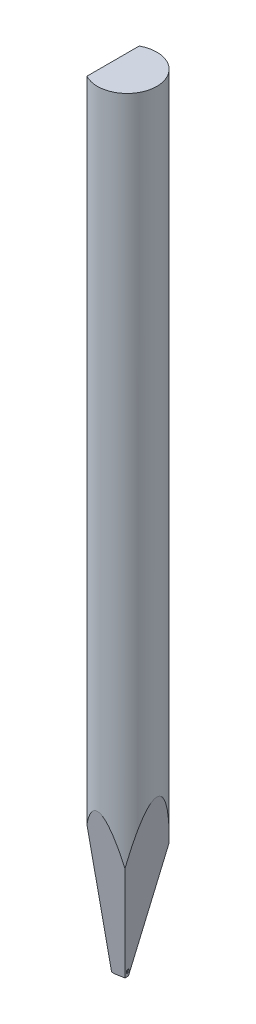
ISO-10303-21;
HEADER;
FILE_DESCRIPTION(('STEP AP214'),'2;1');
FILE_NAME('part.step','',(''),(''),'','','');
FILE_SCHEMA(('AUTOMOTIVE_DESIGN { 1 0 10303 214 1 1 1 1 }'));
ENDSEC;
DATA;
#1=APPLICATION_CONTEXT('core data for automotive mechanical design processes');
#2=APPLICATION_PROTOCOL_DEFINITION('international standard','automotive_design',2000,#1);
#3=PRODUCT_CONTEXT('',#1,'mechanical');
#4=PRODUCT('Part','Part','',(#3));
#5=PRODUCT_RELATED_PRODUCT_CATEGORY('part','',(#4));
#6=PRODUCT_DEFINITION_FORMATION('','',#4);
#7=PRODUCT_DEFINITION_CONTEXT('part definition',#1,'design');
#8=PRODUCT_DEFINITION('design','',#6,#7);
#9=PRODUCT_DEFINITION_SHAPE('','',#8);
#10=(LENGTH_UNIT() NAMED_UNIT(*) SI_UNIT(.MILLI.,.METRE.));
#11=(NAMED_UNIT(*) PLANE_ANGLE_UNIT() SI_UNIT($,.RADIAN.));
#12=(NAMED_UNIT(*) SI_UNIT($,.STERADIAN.) SOLID_ANGLE_UNIT());
#13=UNCERTAINTY_MEASURE_WITH_UNIT(LENGTH_MEASURE(1.E-05),#10,'distance_accuracy_value','');
#14=(GEOMETRIC_REPRESENTATION_CONTEXT(3) GLOBAL_UNCERTAINTY_ASSIGNED_CONTEXT((#13)) GLOBAL_UNIT_ASSIGNED_CONTEXT((#10,
#11,#12)) REPRESENTATION_CONTEXT('',''));
#15=CARTESIAN_POINT('',(0.,0.,0.));
#16=DIRECTION('',(0.,0.,1.));
#17=DIRECTION('',(1.,0.,0.));
#18=AXIS2_PLACEMENT_3D('',#15,#16,#17);
#19=CARTESIAN_POINT('',(-0.35306,0.02286,26.4515969491216));
#20=DIRECTION('',(0.,0.,-1.));
#21=DIRECTION('',(-1.,0.,0.));
#22=AXIS2_PLACEMENT_3D('',#19,#20,#21);
#23=CYLINDRICAL_SURFACE('',#22,0.02286);
#24=DIRECTION('',(0.,0.,-1.));
#25=VECTOR('',#24,1.);
#26=CARTESIAN_POINT('',(-0.35306,0.,26.4515969491216));
#27=LINE('',#26,#25);
#28=CARTESIAN_POINT('',(-0.353059999999999,0.,-0.0305592719154106));
#29=VERTEX_POINT('',#28);
#30=CARTESIAN_POINT('',(-0.35306,0.,-0.0380999999999992));
#31=VERTEX_POINT('',#30);
#32=EDGE_CURVE('E226',#29,#31,#27,.T.);
#33=ORIENTED_EDGE('',*,*,#32,.F.);
#34=CARTESIAN_POINT('',(-0.353060000136931,0.,0.0305592719154105));
#35=CARTESIAN_POINT('',(-0.359442468957151,3.82309618898692E-11,0.0308319241420848));
#36=CARTESIAN_POINT('',(-0.364146777185343,0.00166563698878413,0.0243095121966664));
#37=CARTESIAN_POINT('',(-0.371647527256887,0.00909526449847842,0.0155317534591453));
#38=CARTESIAN_POINT('',(-0.374441075969854,0.0127692328737348,0.0124228194201893));
#39=CARTESIAN_POINT('',(-0.376087286033859,0.0216673996389667,0.00775783689648507));
#40=CARTESIAN_POINT('',(-0.376022588475999,0.025318975171989,0.00619824157381067));
#41=CARTESIAN_POINT('',(-0.374406054380592,0.0316732281710679,0.00309584571980608));
#42=CARTESIAN_POINT('',(-0.372857795646379,0.0342892121612932,0.00155884239990519));
#43=CARTESIAN_POINT('',(-0.372856893602476,0.0342907745483825,-0.00153003910448281));
#44=CARTESIAN_POINT('',(-0.374404543387544,0.0316781034314046,-0.00307639910111903));
#45=CARTESIAN_POINT('',(-0.376023198376415,0.0253176413235304,-0.00620325873008807));
#46=CARTESIAN_POINT('',(-0.376087099954471,0.0216631391996921,-0.00777053455274175));
#47=CARTESIAN_POINT('',(-0.374438996349051,0.0127645085577113,-0.0124354531726147));
#48=CARTESIAN_POINT('',(-0.371654981711114,0.00910677726717238,-0.0155000901940218));
#49=CARTESIAN_POINT('',(-0.364172422185122,0.00168281428800278,-0.0242565037445474));
#50=CARTESIAN_POINT('',(-0.359457905415776,0.,-0.0308389625094695));
#51=CARTESIAN_POINT('',(-0.35306,0.,-0.0305592719154105));
#52=(BOUNDED_CURVE() B_SPLINE_CURVE(3,(#34,#35,#36,#37,#38,#39,#40,#41,#42,#43,#44,#45,#46,#47,
#48,#49,#50,#51),.UNSPECIFIED.,.F.,.F.) B_SPLINE_CURVE_WITH_KNOTS((4,2,2,2,2,2,2,2,4),(0.,
1.79522066859617E-05,2.6928310028942E-05,3.14163617004321E-05,3.59044133719222E-05,
4.03924650434123E-05,4.48805167149025E-05,5.38566200578827E-05,7.18088267438432E-05),
.UNSPECIFIED.) CURVE() GEOMETRIC_REPRESENTATION_ITEM() RATIONAL_B_SPLINE_CURVE((1.,1.,1.,1.,1.,
1.,1.,1.,1.,1.,1.,1.,1.,1.,1.,1.,1.,1.)) REPRESENTATION_ITEM(''));
#53=CARTESIAN_POINT('',(-0.375907824541282,0.02285997398056,-0.00729205217639912));
#54=VERTEX_POINT('',#53);
#55=EDGE_CURVE('E371',#29,#54,#52,.F.);
#56=ORIENTED_EDGE('',*,*,#55,.T.);
#57=DIRECTION('',(0.,0.,-1.));
#58=VECTOR('',#57,1.);
#59=CARTESIAN_POINT('',(-0.37592,0.02286,26.4515969491216));
#60=LINE('',#59,#58);
#61=CARTESIAN_POINT('',(-0.37592,0.02286,-0.0421308347789973));
#62=VERTEX_POINT('',#61);
#63=EDGE_CURVE('E214',#54,#62,#60,.T.);
#64=ORIENTED_EDGE('',*,*,#63,.T.);
#65=CARTESIAN_POINT('',(-0.35306,0.02286,-0.0421308347789973));
#66=DIRECTION('',(0.,-0.173648177666931,-0.984807753012208));
#67=DIRECTION('',(0.,0.984807753012208,-0.173648177666931));
#68=AXIS2_PLACEMENT_3D('',#65,#66,#67);
#69=ELLIPSE('',#68,0.0232126523477081,0.02286);
#70=EDGE_CURVE('E438',#62,#31,#69,.F.);
#71=ORIENTED_EDGE('',*,*,#70,.T.);
#72=EDGE_LOOP('',(#33,#56,#64,#71));
#73=FACE_BOUND('',#72,.T.);
#74=ADVANCED_FACE('F47',(#73),#23,.T.);
#75=CARTESIAN_POINT('',(0.,0.,0.));
#76=DIRECTION('',(0.,1.,0.));
#77=DIRECTION('',(0.,0.,1.));
#78=AXIS2_PLACEMENT_3D('',#75,#76,#77);
#79=PLANE('',#78);
#80=DIRECTION('',(-1.,0.,0.));
#81=VECTOR('',#80,1.);
#82=CARTESIAN_POINT('',(26.8452969491216,0.,0.0305592719154106));
#83=LINE('',#82,#81);
#84=CARTESIAN_POINT('',(-0.289560000000001,0.,0.0305592719154106));
#85=VERTEX_POINT('',#84);
#86=CARTESIAN_POINT('',(-0.35306,0.,0.030559272275299));
#87=VERTEX_POINT('',#86);
#88=EDGE_CURVE('E389',#85,#87,#83,.T.);
#89=ORIENTED_EDGE('',*,*,#88,.F.);
#90=DIRECTION('',(0.,0.,-1.));
#91=VECTOR('',#90,1.);
#92=CARTESIAN_POINT('',(-0.28956,0.,27.2760283406468));
#93=LINE('',#92,#91);
#94=CARTESIAN_POINT('',(-0.289560000000006,0.,0.0381));
#95=VERTEX_POINT('',#94);
#96=EDGE_CURVE('E485',#95,#85,#93,.T.);
#97=ORIENTED_EDGE('',*,*,#96,.F.);
#98=DIRECTION('',(-1.,0.,0.));
#99=VECTOR('',#98,1.);
#100=CARTESIAN_POINT('',(26.8738719491216,0.,0.0381));
#101=LINE('',#100,#99);
#102=CARTESIAN_POINT('',(-0.35306,0.,0.0380999999999983));
#103=VERTEX_POINT('',#102);
#104=EDGE_CURVE('E473',#95,#103,#101,.T.);
#105=ORIENTED_EDGE('',*,*,#104,.T.);
#106=EDGE_CURVE('E222',#103,#87,#27,.T.);
#107=ORIENTED_EDGE('',*,*,#106,.T.);
#108=EDGE_LOOP('',(#89,#97,#105,#107));
#109=FACE_BOUND('',#108,.T.);
#110=ADVANCED_FACE('F265',(#109),#79,.F.);
#111=CARTESIAN_POINT('',(26.8738719491216,0.,0.0381));
#112=DIRECTION('',(0.,-0.173648177666931,0.984807753012208));
#113=DIRECTION('',(0.,-0.984807753012208,-0.173648177666931));
#114=AXIS2_PLACEMENT_3D('',#111,#112,#113);
#115=PLANE('',#114);
#116=CARTESIAN_POINT('',(-0.35306,0.02286,0.0421308347789938));
#117=DIRECTION('',(0.,-0.173648177666931,0.984807753012208));
#118=DIRECTION('',(0.,-0.984807753012208,-0.173648177666931));
#119=AXIS2_PLACEMENT_3D('',#116,#117,#118);
#120=ELLIPSE('',#119,0.0232126523477081,0.02286);
#121=CARTESIAN_POINT('',(-0.37592,0.02286,0.0421308347789938));
#122=VERTEX_POINT('',#121);
#123=EDGE_CURVE('E491',#103,#122,#120,.F.);
#124=ORIENTED_EDGE('',*,*,#123,.F.);
#125=ORIENTED_EDGE('',*,*,#104,.F.);
#126=DIRECTION('',(-0.984346441568213,-0.173566836012845,-0.0306045161452665));
#127=VECTOR('',#126,1.);
#128=CARTESIAN_POINT('',(26.0301191721138,4.64086956163433,0.856410517664803));
#129=LINE('',#128,#127);
#130=CARTESIAN_POINT('',(-0.0116803882692911,0.0489976729369165,0.0467396117307074));
#131=VERTEX_POINT('',#130);
#132=EDGE_CURVE('E476',#131,#95,#129,.T.);
#133=ORIENTED_EDGE('',*,*,#132,.F.);
#134=DIRECTION('',(-0.171087869746036,-0.970287525247814,-0.171087869746036));
#135=VECTOR('',#134,1.);
#136=CARTESIAN_POINT('',(0.766901483986015,4.46455489014234,0.825321483986016));
#137=LINE('',#136,#135);
#138=CARTESIAN_POINT('',(0.530396157131959,3.12326652971219,0.588816157131959));
#139=VERTEX_POINT('',#138);
#140=EDGE_CURVE('E479',#139,#131,#137,.T.);
#141=ORIENTED_EDGE('',*,*,#140,.F.);
#142=CARTESIAN_POINT('',(0.,-0.216075837327433,0.));
#143=DIRECTION('',(0.,-0.173648177666931,0.984807753012208));
#144=DIRECTION('',(0.,-0.984807753012208,-0.173648177666931));
#145=AXIS2_PLACEMENT_3D('',#142,#143,#144);
#146=ELLIPSE('',#145,4.56371043248163,0.792479999999998);
#147=CARTESIAN_POINT('',(-0.37592,3.74046620982329,0.69764511322018));
#148=VERTEX_POINT('',#147);
#149=EDGE_CURVE('E467',#139,#148,#146,.T.);
#150=ORIENTED_EDGE('',*,*,#149,.T.);
#151=DIRECTION('',(0.,0.984807753012208,0.173648177666931));
#152=VECTOR('',#151,1.);
#153=CARTESIAN_POINT('',(-0.37592,20.2115576196122,3.60194293048141));
#154=LINE('',#153,#152);
#155=EDGE_CURVE('E453',#122,#148,#154,.T.);
#156=ORIENTED_EDGE('',*,*,#155,.F.);
#157=EDGE_LOOP('',(#124,#125,#133,#141,#150,#156));
#158=FACE_BOUND('',#157,.T.);
#159=ADVANCED_FACE('F497',(#158),#115,.T.);
#160=CARTESIAN_POINT('',(26.8738719491216,0.,-0.0381));
#161=DIRECTION('',(0.,-0.173648177666931,-0.984807753012208));
#162=DIRECTION('',(0.,0.984807753012208,-0.173648177666931));
#163=AXIS2_PLACEMENT_3D('',#160,#161,#162);
#164=PLANE('',#163);
#165=ORIENTED_EDGE('',*,*,#70,.F.);
#166=DIRECTION('',(0.,-0.984807753012208,0.173648177666931));
#167=VECTOR('',#166,1.);
#168=CARTESIAN_POINT('',(-0.37592,20.5694748591997,-3.66505339668138));
#169=LINE('',#168,#167);
#170=CARTESIAN_POINT('',(-0.37592,3.74046620982329,-0.69764511322018));
#171=VERTEX_POINT('',#170);
#172=EDGE_CURVE('E450',#171,#62,#169,.T.);
#173=ORIENTED_EDGE('',*,*,#172,.F.);
#174=CARTESIAN_POINT('',(0.,-0.216075837327433,0.));
#175=DIRECTION('',(0.,-0.173648177666931,-0.984807753012208));
#176=DIRECTION('',(0.,-0.984807753012208,0.173648177666931));
#177=AXIS2_PLACEMENT_3D('',#174,#175,#176);
#178=ELLIPSE('',#177,4.56371043248163,0.792479999999998);
#179=CARTESIAN_POINT('',(0.530396157131959,3.12326652971219,-0.588816157131959));
#180=VERTEX_POINT('',#179);
#181=EDGE_CURVE('E465',#171,#180,#178,.T.);
#182=ORIENTED_EDGE('',*,*,#181,.T.);
#183=DIRECTION('',(0.171087869746036,0.970287525247814,-0.171087869746036));
#184=VECTOR('',#183,1.);
#185=CARTESIAN_POINT('',(0.766901483986015,4.46455489014234,-0.825321483986016));
#186=LINE('',#185,#184);
#187=CARTESIAN_POINT('',(-0.0116803882692911,0.0489976729369165,-0.0467396117307074));
#188=VERTEX_POINT('',#187);
#189=EDGE_CURVE('E445',#188,#180,#186,.T.);
#190=ORIENTED_EDGE('',*,*,#189,.F.);
#191=DIRECTION('',(0.984346441568213,0.173566836012845,-0.0306045161452665));
#192=VECTOR('',#191,1.);
#193=CARTESIAN_POINT('',(26.0301191721138,4.64086956163433,-0.856410517664803));
#194=LINE('',#193,#192);
#195=CARTESIAN_POINT('',(-0.289560000000006,0.,-0.0381));
#196=VERTEX_POINT('',#195);
#197=EDGE_CURVE('E441',#196,#188,#194,.T.);
#198=ORIENTED_EDGE('',*,*,#197,.F.);
#199=DIRECTION('',(-1.,0.,0.));
#200=VECTOR('',#199,1.);
#201=CARTESIAN_POINT('',(26.8738719491216,0.,-0.0381));
#202=LINE('',#201,#200);
#203=EDGE_CURVE('E470',#196,#31,#202,.T.);
#204=ORIENTED_EDGE('',*,*,#203,.T.);
#205=EDGE_LOOP('',(#165,#173,#182,#190,#198,#204));
#206=FACE_BOUND('',#205,.T.);
#207=ADVANCED_FACE('F255',(#206),#164,.T.);
#208=CARTESIAN_POINT('',(-0.289560000000001,0.,-0.0305592719154106));
#209=VERTEX_POINT('',#208);
#210=EDGE_CURVE('E488',#209,#196,#93,.T.);
#211=ORIENTED_EDGE('',*,*,#210,.F.);
#212=DIRECTION('',(-1.,0.,0.));
#213=VECTOR('',#212,1.);
#214=CARTESIAN_POINT('',(26.8452969491216,0.,-0.0305592719154106));
#215=LINE('',#214,#213);
#216=EDGE_CURVE('E409',#209,#29,#215,.T.);
#217=ORIENTED_EDGE('',*,*,#216,.T.);
#218=ORIENTED_EDGE('',*,*,#32,.T.);
#219=ORIENTED_EDGE('',*,*,#203,.F.);
#220=EDGE_LOOP('',(#211,#217,#218,#219));
#221=FACE_BOUND('',#220,.T.);
#222=ADVANCED_FACE('F261',(#221),#79,.F.);
#223=CARTESIAN_POINT('',(0.,21.0312,0.));
#224=DIRECTION('',(0.,-1.,0.));
#225=DIRECTION('',(0.,0.,-1.));
#226=AXIS2_PLACEMENT_3D('',#223,#224,#225);
#227=CYLINDRICAL_SURFACE('',#226,0.792479999999998);
#228=ORIENTED_EDGE('',*,*,#149,.F.);
#229=CARTESIAN_POINT('',(0.,0.115240446574631,0.));
#230=DIRECTION('',(-0.984807753012208,0.173648177666931,0.));
#231=DIRECTION('',(-0.173648177666931,-0.984807753012208,0.));
#232=AXIS2_PLACEMENT_3D('',#229,#230,#231);
#233=ELLIPSE('',#232,4.56371043248165,0.792479999999998);
#234=EDGE_CURVE('E482',#139,#180,#233,.T.);
#235=ORIENTED_EDGE('',*,*,#234,.T.);
#236=ORIENTED_EDGE('',*,*,#181,.F.);
#237=DIRECTION('',(0.,-1.,0.));
#238=VECTOR('',#237,1.);
#239=CARTESIAN_POINT('',(-0.37592,21.0312,-0.69764511322018));
#240=LINE('',#239,#238);
#241=CARTESIAN_POINT('',(-0.37592,21.0312,-0.69764511322018));
#242=VERTEX_POINT('',#241);
#243=EDGE_CURVE('E458',#242,#171,#240,.T.);
#244=ORIENTED_EDGE('',*,*,#243,.F.);
#245=CARTESIAN_POINT('',(0.,21.0312,0.));
#246=DIRECTION('',(0.,1.,0.));
#247=DIRECTION('',(0.,0.,1.));
#248=AXIS2_PLACEMENT_3D('',#245,#246,#247);
#249=CIRCLE('',#248,0.792479999999998);
#250=CARTESIAN_POINT('',(-0.37592,21.0312,0.69764511322018));
#251=VERTEX_POINT('',#250);
#252=EDGE_CURVE('E455',#251,#242,#249,.T.);
#253=ORIENTED_EDGE('',*,*,#252,.F.);
#254=DIRECTION('',(0.,-1.,0.));
#255=VECTOR('',#254,1.);
#256=CARTESIAN_POINT('',(-0.37592,21.0312,0.69764511322018));
#257=LINE('',#256,#255);
#258=EDGE_CURVE('E461',#148,#251,#257,.F.);
#259=ORIENTED_EDGE('',*,*,#258,.F.);
#260=EDGE_LOOP('',(#228,#235,#236,#244,#253,#259));
#261=FACE_BOUND('',#260,.T.);
#262=ADVANCED_FACE('F254',(#261),#227,.T.);
#263=CARTESIAN_POINT('',(-0.37592,21.0312,-1.04648));
#264=DIRECTION('',(-1.,0.,0.));
#265=DIRECTION('',(0.,0.,1.));
#266=AXIS2_PLACEMENT_3D('',#263,#264,#265);
#267=PLANE('',#266);
#268=ORIENTED_EDGE('',*,*,#63,.F.);
#269=CARTESIAN_POINT('',(-0.37592,0.0228540642010326,0.00728461074809682));
#270=CARTESIAN_POINT('',(-0.37592,0.0245218389897554,0.00237481931835743));
#271=CARTESIAN_POINT('',(-0.37592,0.024532126460302,-0.00233660110364053));
#272=CARTESIAN_POINT('',(-0.37592,0.0228540727902696,-0.00729212838858676));
#273=(BOUNDED_CURVE() B_SPLINE_CURVE(3,(#269,#270,#271,#272),.UNSPECIFIED.,.F.,
.F.) B_SPLINE_CURVE_WITH_KNOTS((4,4),(2.88793076500569E-05,4.29308204810156E-05),
.UNSPECIFIED.) CURVE() GEOMETRIC_REPRESENTATION_ITEM() RATIONAL_B_SPLINE_CURVE((1.,1.,1.,1.)) REPRESENTATION_ITEM(''));
#274=CARTESIAN_POINT('',(-0.37592,0.02286,0.00728468448811526));
#275=VERTEX_POINT('',#274);
#276=EDGE_CURVE('E236',#54,#275,#273,.F.);
#277=ORIENTED_EDGE('',*,*,#276,.T.);
#278=EDGE_CURVE('E229',#122,#275,#60,.T.);
#279=ORIENTED_EDGE('',*,*,#278,.F.);
#280=ORIENTED_EDGE('',*,*,#155,.T.);
#281=ORIENTED_EDGE('',*,*,#258,.T.);
#282=DIRECTION('',(0.,0.,-1.));
#283=VECTOR('',#282,1.);
#284=CARTESIAN_POINT('',(-0.37592,21.0312,-1.04648));
#285=LINE('',#284,#283);
#286=EDGE_CURVE('E463',#251,#242,#285,.T.);
#287=ORIENTED_EDGE('',*,*,#286,.T.);
#288=ORIENTED_EDGE('',*,*,#243,.T.);
#289=ORIENTED_EDGE('',*,*,#172,.T.);
#290=EDGE_LOOP('',(#268,#277,#279,#280,#281,#287,#288,#289));
#291=FACE_BOUND('',#290,.T.);
#292=ADVANCED_FACE('F243',(#291),#267,.T.);
#293=CARTESIAN_POINT('',(0.,21.0312,0.));
#294=DIRECTION('',(0.,1.,0.));
#295=DIRECTION('',(0.,0.,1.));
#296=AXIS2_PLACEMENT_3D('',#293,#294,#295);
#297=PLANE('',#296);
#298=ORIENTED_EDGE('',*,*,#252,.T.);
#299=ORIENTED_EDGE('',*,*,#286,.F.);
#300=EDGE_LOOP('',(#298,#299));
#301=FACE_BOUND('',#300,.T.);
#302=ADVANCED_FACE('F253',(#301),#297,.T.);
#303=CARTESIAN_POINT('',(-0.28956,0.,27.2760283406468));
#304=DIRECTION('',(-0.173648177666931,0.984807753012208,0.));
#305=DIRECTION('',(-0.984807753012208,-0.173648177666931,0.));
#306=AXIS2_PLACEMENT_3D('',#303,#304,#305);
#307=PLANE('',#306);
#308=CARTESIAN_POINT('',(-0.973800151536874,-0.12065,0.));
#309=DIRECTION('',(-0.173648177666931,0.984807753012208,0.));
#310=DIRECTION('',(-0.984807753012208,-0.173648177666931,0.));
#311=AXIS2_PLACEMENT_3D('',#308,#309,#310);
#312=ELLIPSE('',#311,0.716736574332053,0.12446);
#313=CARTESIAN_POINT('',(-0.282804955509951,0.00119109659948194,0.0253976136563203));
#314=VERTEX_POINT('',#313);
#315=EDGE_CURVE('E211',#85,#314,#312,.T.);
#316=ORIENTED_EDGE('',*,*,#315,.T.);
#317=CARTESIAN_POINT('',(-0.282357360080556,0.00127001975012588,0.));
#318=DIRECTION('',(-0.173648177666931,0.984807753012208,0.));
#319=DIRECTION('',(-0.984807753012208,-0.173648177666931,0.));
#320=AXIS2_PLACEMENT_3D('',#317,#318,#319);
#321=ELLIPSE('',#320,0.03315734514904,0.0254);
#322=CARTESIAN_POINT('',(-0.282357360080556,0.00127001975012588,0.0253999999999992));
#323=VERTEX_POINT('',#322);
#324=EDGE_CURVE('E210',#314,#323,#321,.T.);
#325=ORIENTED_EDGE('',*,*,#324,.T.);
#326=DIRECTION('',(-0.984807753012208,-0.173648177666931,0.));
#327=VECTOR('',#326,1.);
#328=CARTESIAN_POINT('',(-0.28956,0.,0.0253999999999983));
#329=LINE('',#328,#327);
#330=CARTESIAN_POINT('',(-0.0990600000000001,0.0335902898249627,0.0253999999999992));
#331=VERTEX_POINT('',#330);
#332=EDGE_CURVE('E372',#331,#323,#329,.T.);
#333=ORIENTED_EDGE('',*,*,#332,.F.);
#334=DIRECTION('',(0.,0.,1.));
#335=VECTOR('',#334,1.);
#336=CARTESIAN_POINT('',(-0.0990600000000001,0.0335902898249628,27.2760283406468));
#337=LINE('',#336,#335);
#338=CARTESIAN_POINT('',(-0.0990600000000001,0.0335902898249627,-0.0253999999999992));
#339=VERTEX_POINT('',#338);
#340=EDGE_CURVE('E373',#339,#331,#337,.T.);
#341=ORIENTED_EDGE('',*,*,#340,.F.);
#342=DIRECTION('',(-0.984807753012208,-0.173648177666931,0.));
#343=VECTOR('',#342,1.);
#344=CARTESIAN_POINT('',(-0.28956,0.,-0.0253999999999983));
#345=LINE('',#344,#343);
#346=CARTESIAN_POINT('',(-0.282357360080556,0.00127001975012586,-0.0253999999999992));
#347=VERTEX_POINT('',#346);
#348=EDGE_CURVE('E379',#339,#347,#345,.T.);
#349=ORIENTED_EDGE('',*,*,#348,.T.);
#350=CARTESIAN_POINT('',(-0.282804955533828,0.00119109662363526,-0.0253976136574304));
#351=VERTEX_POINT('',#350);
#352=EDGE_CURVE('E207',#347,#351,#321,.T.);
#353=ORIENTED_EDGE('',*,*,#352,.T.);
#354=EDGE_CURVE('E215',#351,#209,#312,.T.);
#355=ORIENTED_EDGE('',*,*,#354,.T.);
#356=ORIENTED_EDGE('',*,*,#210,.T.);
#357=ORIENTED_EDGE('',*,*,#197,.T.);
#358=DIRECTION('',(0.,0.,-1.));
#359=VECTOR('',#358,1.);
#360=CARTESIAN_POINT('',(-0.0116803882692927,0.0489976729369164,27.2760283406468));
#361=LINE('',#360,#359);
#362=EDGE_CURVE('E489',#131,#188,#361,.T.);
#363=ORIENTED_EDGE('',*,*,#362,.F.);
#364=ORIENTED_EDGE('',*,*,#132,.T.);
#365=ORIENTED_EDGE('',*,*,#96,.T.);
#366=EDGE_LOOP('',(#316,#325,#333,#341,#349,#353,#355,#356,#357,#363,#364,#365));
#367=FACE_BOUND('',#366,.T.);
#368=ADVANCED_FACE('F259',(#367),#307,.F.);
#369=CARTESIAN_POINT('',(-0.0116803882692927,0.0489976729369164,27.2760283406468));
#370=DIRECTION('',(-0.984807753012208,0.173648177666931,0.));
#371=DIRECTION('',(-0.173648177666931,-0.984807753012208,0.));
#372=AXIS2_PLACEMENT_3D('',#369,#370,#371);
#373=PLANE('',#372);
#374=CARTESIAN_POINT('',(0.0141555961862647,0.195520821871644,0.));
#375=DIRECTION('',(-0.984807753012208,0.173648177666931,0.));
#376=DIRECTION('',(0.173648177666931,0.984807753012208,0.));
#377=AXIS2_PLACEMENT_3D('',#374,#375,#376);
#378=ELLIPSE('',#377,0.0515734368592615,0.0370444608655554);
#379=CARTESIAN_POINT('',(0.0231112295128959,0.246310742340131,0.));
#380=VERTEX_POINT('',#379);
#381=EDGE_CURVE('E419',#380,#380,#378,.F.);
#382=ORIENTED_EDGE('',*,*,#381,.F.);
#383=EDGE_LOOP('',(#382));
#384=FACE_BOUND('',#383,.T.);
#385=ORIENTED_EDGE('',*,*,#234,.F.);
#386=ORIENTED_EDGE('',*,*,#140,.T.);
#387=ORIENTED_EDGE('',*,*,#362,.T.);
#388=ORIENTED_EDGE('',*,*,#189,.T.);
#389=EDGE_LOOP('',(#385,#386,#387,#388));
#390=FACE_BOUND('',#389,.T.);
#391=ADVANCED_FACE('F401',(#384,#390),#373,.F.);
#392=ORIENTED_EDGE('',*,*,#278,.T.);
#393=CARTESIAN_POINT('',(-0.353060000136931,0.,0.0305592719154105));
#394=CARTESIAN_POINT('',(-0.359442468957151,3.82309618898692E-11,0.0308319241420848));
#395=CARTESIAN_POINT('',(-0.364146777185343,0.00166563698878413,0.0243095121966664));
#396=CARTESIAN_POINT('',(-0.371647527256887,0.00909526449847842,0.0155317534591453));
#397=CARTESIAN_POINT('',(-0.374441075969854,0.0127692328737348,0.0124228194201893));
#398=CARTESIAN_POINT('',(-0.376087286033859,0.0216673996389667,0.00775783689648507));
#399=CARTESIAN_POINT('',(-0.376022588475999,0.025318975171989,0.00619824157381067));
#400=CARTESIAN_POINT('',(-0.374406054380592,0.0316732281710679,0.00309584571980608));
#401=CARTESIAN_POINT('',(-0.372857795646379,0.0342892121612932,0.00155884239990519));
#402=CARTESIAN_POINT('',(-0.372856893602476,0.0342907745483825,-0.00153003910448281));
#403=CARTESIAN_POINT('',(-0.374404543387544,0.0316781034314046,-0.00307639910111903));
#404=CARTESIAN_POINT('',(-0.376023198376415,0.0253176413235304,-0.00620325873008807));
#405=CARTESIAN_POINT('',(-0.376087099954471,0.0216631391996921,-0.00777053455274175));
#406=CARTESIAN_POINT('',(-0.374438996349051,0.0127645085577113,-0.0124354531726147));
#407=CARTESIAN_POINT('',(-0.371654981711114,0.00910677726717238,-0.0155000901940218));
#408=CARTESIAN_POINT('',(-0.364172422185122,0.00168281428800278,-0.0242565037445474));
#409=CARTESIAN_POINT('',(-0.359457905415776,0.,-0.0308389625094695));
#410=CARTESIAN_POINT('',(-0.35306,0.,-0.0305592719154105));
#411=(BOUNDED_CURVE() B_SPLINE_CURVE(3,(#393,#394,#395,#396,#397,#398,#399,#400,#401,#402,#403,
#404,#405,#406,#407,#408,#409,#410),.UNSPECIFIED.,.F.,.F.) B_SPLINE_CURVE_WITH_KNOTS((4,2,2,2,2,
2,2,2,4),(0.,1.79522066859617E-05,2.6928310028942E-05,3.14163617004321E-05,3.59044133719222E-05,
4.03924650434123E-05,4.48805167149025E-05,5.38566200578827E-05,7.18088267438432E-05),
.UNSPECIFIED.) CURVE() GEOMETRIC_REPRESENTATION_ITEM() RATIONAL_B_SPLINE_CURVE((1.,1.,1.,1.,1.,
1.,1.,1.,1.,1.,1.,1.,1.,1.,1.,1.,1.,1.)) REPRESENTATION_ITEM(''));
#412=EDGE_CURVE('E367',#275,#87,#411,.F.);
#413=ORIENTED_EDGE('',*,*,#412,.T.);
#414=ORIENTED_EDGE('',*,*,#106,.F.);
#415=ORIENTED_EDGE('',*,*,#123,.T.);
#416=EDGE_LOOP('',(#392,#413,#414,#415));
#417=FACE_BOUND('',#416,.T.);
#418=ADVANCED_FACE('F390',(#417),#23,.T.);
#419=CARTESIAN_POINT('',(26.8452969491216,-0.12065,0.));
#420=DIRECTION('',(-1.,0.,0.));
#421=DIRECTION('',(0.,0.,1.));
#422=AXIS2_PLACEMENT_3D('',#419,#420,#421);
#423=CYLINDRICAL_SURFACE('',#422,0.12446);
#424=ORIENTED_EDGE('',*,*,#88,.T.);
#425=CARTESIAN_POINT('',(-0.35306,0.,-0.0305592719154105));
#426=CARTESIAN_POINT('',(-0.359523920354631,0.000268023803847055,-0.0295010964450113));
#427=CARTESIAN_POINT('',(-0.360063607427486,0.00193752747481201,-0.0222647525046323));
#428=CARTESIAN_POINT('',(-0.358950326935429,0.00308629466556907,-0.0137077845239685));
#429=CARTESIAN_POINT('',(-0.358158793396155,0.00336424367762856,-0.0108840109054126));
#430=CARTESIAN_POINT('',(-0.356832465590862,0.00363566720918247,-0.00672980003040049));
#431=CARTESIAN_POINT('',(-0.35635655450616,0.00370202721983736,-0.00535793360263258));
#432=CARTESIAN_POINT('',(-0.355571144398865,0.00378930455175108,-0.00264454322141367));
#433=CARTESIAN_POINT('',(-0.355259664096056,0.00381013164329394,-0.00131722199930476));
#434=CARTESIAN_POINT('',(-0.355259745896921,0.00380986712519868,0.00134198272693785));
#435=CARTESIAN_POINT('',(-0.3555713625057,0.00378883286851432,0.00266129806945499));
#436=CARTESIAN_POINT('',(-0.356356454281731,0.00370209834135994,0.00535362224977508));
#437=CARTESIAN_POINT('',(-0.356832490786919,0.00363626257815359,0.00671878992294829));
#438=CARTESIAN_POINT('',(-0.358159202153698,0.0033652135167825,0.0108729403145914));
#439=CARTESIAN_POINT('',(-0.358948511601902,0.00308335284451468,0.0137357887088779));
#440=CARTESIAN_POINT('',(-0.360051466672799,0.00192935430352922,0.0223133388118004));
#441=CARTESIAN_POINT('',(-0.359506760032511,0.00026916178251091,0.0294966036309752));
#442=CARTESIAN_POINT('',(-0.353060000136931,0.,0.0305592719154105));
#443=(BOUNDED_CURVE() B_SPLINE_CURVE(3,(#425,#426,#427,#428,#429,#430,#431,#432,#433,#434,#435,
#436,#437,#438,#439,#440,#441,#442),.UNSPECIFIED.,.F.,.F.) B_SPLINE_CURVE_WITH_KNOTS((4,2,2,2,2,
2,2,2,4),(0.,1.79522066859617E-05,2.6928310028942E-05,3.14163617004321E-05,3.59044133719222E-05,
4.03924650434123E-05,4.48805167149025E-05,5.38566200578827E-05,7.18088267438432E-05),
.UNSPECIFIED.) CURVE() GEOMETRIC_REPRESENTATION_ITEM() RATIONAL_B_SPLINE_CURVE((1.,1.,1.,1.,1.,
1.,1.,1.,1.,1.,1.,1.,1.,1.,1.,1.,1.,1.)) REPRESENTATION_ITEM(''));
#444=CARTESIAN_POINT('',(-0.356691162590947,0.00364995365342963,0.00630976400154925));
#445=VERTEX_POINT('',#444);
#446=EDGE_CURVE('E12',#87,#445,#443,.F.);
#447=ORIENTED_EDGE('',*,*,#446,.T.);
#448=CARTESIAN_POINT('',(-0.356690772693881,0.00364962380844364,-0.00631625847155524));
#449=CARTESIAN_POINT('',(-0.355263429626996,0.00387128793352608,-0.00195406090100432));
#450=CARTESIAN_POINT('',(-0.355271214160604,0.00386939066897885,0.00198693816275655));
#451=CARTESIAN_POINT('',(-0.356691162590947,0.00364995365343003,0.00630976400154927));
#452=(BOUNDED_CURVE() B_SPLINE_CURVE(3,(#448,#449,#450,#451),.UNSPECIFIED.,.F.,
.F.) B_SPLINE_CURVE_WITH_KNOTS((4,4),(2.88793076500569E-05,4.29308204810156E-05),
.UNSPECIFIED.) CURVE() GEOMETRIC_REPRESENTATION_ITEM() RATIONAL_B_SPLINE_CURVE((1.,1.,1.,1.)) REPRESENTATION_ITEM(''));
#453=CARTESIAN_POINT('',(-0.356688463970425,0.00364962830818683,-0.00631616991907264));
#454=VERTEX_POINT('',#453);
#455=EDGE_CURVE('E60',#445,#454,#452,.F.);
#456=ORIENTED_EDGE('',*,*,#455,.T.);
#457=CARTESIAN_POINT('',(-0.35306,0.,-0.0305592719154105));
#458=CARTESIAN_POINT('',(-0.359523920354631,0.000268023803847055,-0.0295010964450113));
#459=CARTESIAN_POINT('',(-0.360063607427486,0.00193752747481201,-0.0222647525046323));
#460=CARTESIAN_POINT('',(-0.358950326935429,0.00308629466556907,-0.0137077845239685));
#461=CARTESIAN_POINT('',(-0.358158793396155,0.00336424367762856,-0.0108840109054126));
#462=CARTESIAN_POINT('',(-0.356832465590862,0.00363566720918247,-0.00672980003040049));
#463=CARTESIAN_POINT('',(-0.35635655450616,0.00370202721983736,-0.00535793360263258));
#464=CARTESIAN_POINT('',(-0.355571144398865,0.00378930455175108,-0.00264454322141367));
#465=CARTESIAN_POINT('',(-0.355259664096056,0.00381013164329394,-0.00131722199930476));
#466=CARTESIAN_POINT('',(-0.355259745896921,0.00380986712519868,0.00134198272693785));
#467=CARTESIAN_POINT('',(-0.3555713625057,0.00378883286851432,0.00266129806945499));
#468=CARTESIAN_POINT('',(-0.356356454281731,0.00370209834135994,0.00535362224977508));
#469=CARTESIAN_POINT('',(-0.356832490786919,0.00363626257815359,0.00671878992294829));
#470=CARTESIAN_POINT('',(-0.358159202153698,0.0033652135167825,0.0108729403145914));
#471=CARTESIAN_POINT('',(-0.358948511601902,0.00308335284451468,0.0137357887088779));
#472=CARTESIAN_POINT('',(-0.360051466672799,0.00192935430352922,0.0223133388118004));
#473=CARTESIAN_POINT('',(-0.359506760032511,0.00026916178251091,0.0294966036309752));
#474=CARTESIAN_POINT('',(-0.353060000136931,0.,0.0305592719154105));
#475=(BOUNDED_CURVE() B_SPLINE_CURVE(3,(#457,#458,#459,#460,#461,#462,#463,#464,#465,#466,#467,
#468,#469,#470,#471,#472,#473,#474),.UNSPECIFIED.,.F.,.F.) B_SPLINE_CURVE_WITH_KNOTS((4,2,2,2,2,
2,2,2,4),(0.,1.79522066859617E-05,2.6928310028942E-05,3.14163617004321E-05,3.59044133719222E-05,
4.03924650434123E-05,4.48805167149025E-05,5.38566200578827E-05,7.18088267438432E-05),
.UNSPECIFIED.) CURVE() GEOMETRIC_REPRESENTATION_ITEM() RATIONAL_B_SPLINE_CURVE((1.,1.,1.,1.,1.,
1.,1.,1.,1.,1.,1.,1.,1.,1.,1.,1.,1.,1.)) REPRESENTATION_ITEM(''));
#476=EDGE_CURVE('E307',#454,#29,#475,.F.);
#477=ORIENTED_EDGE('',*,*,#476,.T.);
#478=ORIENTED_EDGE('',*,*,#216,.F.);
#479=ORIENTED_EDGE('',*,*,#354,.F.);
#480=CARTESIAN_POINT('',(-0.282403213588334,0.00119059914494907,-0.0254));
#481=CARTESIAN_POINT('',(-0.284114048656526,0.00118933732666653,-0.0254008736110038));
#482=CARTESIAN_POINT('',(-0.285827959812961,0.00121756469276598,-0.0252703448252673));
#483=CARTESIAN_POINT('',(-0.289219223544497,0.00132797296761342,-0.0247348640406917));
#484=CARTESIAN_POINT('',(-0.290896340894559,0.00141043246317623,-0.0243284947196499));
#485=CARTESIAN_POINT('',(-0.294158972042539,0.00162460786516736,-0.0232273074008138));
#486=CARTESIAN_POINT('',(-0.295744096440595,0.00175651769602258,-0.0225313525672754));
#487=CARTESIAN_POINT('',(-0.298749312926613,0.00205315123712625,-0.020855473915669));
#488=CARTESIAN_POINT('',(-0.300169814270598,0.00221779068498355,-0.0198762764192948));
#489=CARTESIAN_POINT('',(-0.302649081861598,0.00253876782148825,-0.017771454809188));
#490=CARTESIAN_POINT('',(-0.303730160703934,0.0026941655778916,-0.0166719537780576));
#491=CARTESIAN_POINT('',(-0.305671800781131,0.00299266801371764,-0.0142904498217119));
#492=CARTESIAN_POINT('',(-0.306532353452891,0.00313577221563433,-0.0130084398126214));
#493=CARTESIAN_POINT('',(-0.307937179445907,0.00337952134616208,-0.0104171809046668));
#494=CARTESIAN_POINT('',(-0.308501922029494,0.00348272030507836,-0.00911922905299647));
#495=CARTESIAN_POINT('',(-0.309399451342884,0.00365031562452278,-0.00644332413853917));
#496=CARTESIAN_POINT('',(-0.309732326835981,0.00371472683248617,-0.00506540190907578));
#497=CARTESIAN_POINT('',(-0.310148229161258,0.00379566973245268,-0.00232075442983043));
#498=CARTESIAN_POINT('',(-0.310239624613896,0.00381380437053763,-0.00095533719587999));
#499=CARTESIAN_POINT('',(-0.310194167228206,0.00380485749460203,0.00177153284769605));
#500=CARTESIAN_POINT('',(-0.310057327411745,0.0037777785602225,0.00313298587905803));
#501=CARTESIAN_POINT('',(-0.309561565073567,0.00368183635351419,0.00580124582006705));
#502=CARTESIAN_POINT('',(-0.309204534957865,0.00361332922869545,0.00710841812837439));
#503=CARTESIAN_POINT('',(-0.308280611743002,0.0034423194982556,0.00964383980067555));
#504=CARTESIAN_POINT('',(-0.30771372384138,0.00333981773458467,0.0108720911184178));
#505=CARTESIAN_POINT('',(-0.306381375775747,0.00311087085575244,0.0132269303757643));
#506=CARTESIAN_POINT('',(-0.305614277459052,0.00298423065655907,0.0143525711098618));
#507=CARTESIAN_POINT('',(-0.303907336808455,0.00272102677893734,0.0164625096468706));
#508=CARTESIAN_POINT('',(-0.302967485435321,0.00258446258146601,0.0174468000488807));
#509=CARTESIAN_POINT('',(-0.300911176071091,0.00231090469253324,0.0192820510640909));
#510=CARTESIAN_POINT('',(-0.299790079390948,0.00217403354614682,0.0201278215565281));
#511=CARTESIAN_POINT('',(-0.297427739726743,0.00191779072895048,0.0216336317558831));
#512=CARTESIAN_POINT('',(-0.296186451268652,0.00179842572480126,0.022293600793721));
#513=CARTESIAN_POINT('',(-0.293528692372339,0.00158017406987833,0.0234617350537596));
#514=CARTESIAN_POINT('',(-0.292106042597665,0.0014832861538612,0.0239561691487609));
#515=CARTESIAN_POINT('',(-0.289202293285621,0.00132933788152937,0.0247284607612176));
#516=CARTESIAN_POINT('',(-0.287721205916757,0.00127226927936936,0.0250063631197928));
#517=CARTESIAN_POINT('',(-0.284958393641335,0.0012056024594966,0.0253277886167715));
#518=CARTESIAN_POINT('',(-0.283680141466866,0.00119016121744694,0.0254002482276603));
#519=CARTESIAN_POINT('',(-0.282403213588358,0.00119059914491426,0.0254000000002));
#520=B_SPLINE_CURVE_WITH_KNOTS('',3,(#480,#481,#482,#483,#484,#485,#486,#487,#488,#489,#490,
#491,#492,#493,#494,#495,#496,#497,#498,#499,#500,#501,#502,#503,#504,#505,#506,#507,#508,#509,
#510,#511,#512,#513,#514,#515,#516,#517,#518,#519),.UNSPECIFIED.,.F.,.F.,(4,2,2,2,2,2,2,2,2,2,2,
2,2,2,2,2,2,2,2,4),(0.,0.00513201299791442,0.0102905968998633,0.0154696260027696,
0.0206354904561227,0.0252596343987876,0.0298839578712177,0.0341205417195983,0.03835550282746,
0.0424416477816933,0.0465275596106417,0.0505788355714684,0.0546300112012455,0.0587154341476658,
0.0628010709230634,0.0670156889865475,0.0712319079095711,0.0757410319273147,0.0802492219113087,
0.0840802159730291),.UNSPECIFIED.);
#521=EDGE_CURVE('E428',#351,#314,#520,.T.);
#522=ORIENTED_EDGE('',*,*,#521,.T.);
#523=ORIENTED_EDGE('',*,*,#315,.F.);
#524=EDGE_LOOP('',(#424,#447,#456,#477,#478,#479,#522,#523));
#525=FACE_BOUND('',#524,.T.);
#526=ADVANCED_FACE('F400',(#525),#423,.F.);
#527=CARTESIAN_POINT('',(-0.0990600000000001,0.1143,0.0254));
#528=DIRECTION('',(-1.,0.,0.));
#529=DIRECTION('',(0.,0.,1.));
#530=AXIS2_PLACEMENT_3D('',#527,#528,#529);
#531=PLANE('',#530);
#532=ORIENTED_EDGE('',*,*,#340,.T.);
#533=DIRECTION('',(0.,1.,0.));
#534=VECTOR('',#533,1.);
#535=CARTESIAN_POINT('',(-0.0990600000000001,0.1143,0.0254));
#536=LINE('',#535,#534);
#537=CARTESIAN_POINT('',(-0.0990600000000001,0.1143,0.0254));
#538=VERTEX_POINT('',#537);
#539=EDGE_CURVE('E192',#331,#538,#536,.T.);
#540=ORIENTED_EDGE('',*,*,#539,.T.);
#541=DIRECTION('',(0.,0.,-1.));
#542=VECTOR('',#541,1.);
#543=CARTESIAN_POINT('',(-0.0990600000000001,0.1143,0.0254));
#544=LINE('',#543,#542);
#545=CARTESIAN_POINT('',(-0.0990600000000001,0.1143,0.02286));
#546=VERTEX_POINT('',#545);
#547=EDGE_CURVE('E179',#538,#546,#544,.T.);
#548=ORIENTED_EDGE('',*,*,#547,.T.);
#549=CARTESIAN_POINT('',(-0.0990600000000001,0.1143,0.));
#550=DIRECTION('',(1.,0.,0.));
#551=DIRECTION('',(0.,1.,0.));
#552=AXIS2_PLACEMENT_3D('',#549,#550,#551);
#553=ELLIPSE('',#552,0.0263964543073496,0.02286);
#554=CARTESIAN_POINT('',(-0.0990600000000001,0.1143,-0.0228599999999995));
#555=VERTEX_POINT('',#554);
#556=EDGE_CURVE('E171',#555,#546,#553,.F.);
#557=ORIENTED_EDGE('',*,*,#556,.F.);
#558=CARTESIAN_POINT('',(-0.0990600000000001,0.1143,-0.0254));
#559=VERTEX_POINT('',#558);
#560=EDGE_CURVE('E176',#555,#559,#544,.T.);
#561=ORIENTED_EDGE('',*,*,#560,.T.);
#562=DIRECTION('',(0.,1.,0.));
#563=VECTOR('',#562,1.);
#564=CARTESIAN_POINT('',(-0.0990600000000001,0.1143,-0.0254));
#565=LINE('',#564,#563);
#566=EDGE_CURVE('E199',#339,#559,#565,.T.);
#567=ORIENTED_EDGE('',*,*,#566,.F.);
#568=EDGE_LOOP('',(#532,#540,#548,#557,#561,#567));
#569=FACE_BOUND('',#568,.T.);
#570=ADVANCED_FACE('F173',(#569),#531,.T.);
#571=CARTESIAN_POINT('',(0.,0.,0.0254));
#572=DIRECTION('',(0.,0.,-1.));
#573=DIRECTION('',(-1.,0.,0.));
#574=AXIS2_PLACEMENT_3D('',#571,#572,#573);
#575=PLANE('',#574);
#576=ORIENTED_EDGE('',*,*,#332,.T.);
#577=DIRECTION('',(-0.500000000000004,-0.866025403784436,0.));
#578=VECTOR('',#577,1.);
#579=CARTESIAN_POINT('',(-0.212317954743874,0.122581828325168,0.0254));
#580=LINE('',#579,#578);
#581=CARTESIAN_POINT('',(-0.217099470556792,0.1143,0.0254));
#582=VERTEX_POINT('',#581);
#583=EDGE_CURVE('E194',#582,#323,#580,.T.);
#584=ORIENTED_EDGE('',*,*,#583,.F.);
#585=DIRECTION('',(-1.,0.,0.));
#586=VECTOR('',#585,1.);
#587=CARTESIAN_POINT('',(-0.246428864231625,0.1143,0.0254));
#588=LINE('',#587,#586);
#589=EDGE_CURVE('E195',#538,#582,#588,.T.);
#590=ORIENTED_EDGE('',*,*,#589,.F.);
#591=ORIENTED_EDGE('',*,*,#539,.F.);
#592=EDGE_LOOP('',(#576,#584,#590,#591));
#593=FACE_BOUND('',#592,.T.);
#594=ADVANCED_FACE('F542',(#593),#575,.T.);
#595=CARTESIAN_POINT('',(0.,0.,-0.0254));
#596=DIRECTION('',(0.,0.,-1.));
#597=DIRECTION('',(-1.,0.,0.));
#598=AXIS2_PLACEMENT_3D('',#595,#596,#597);
#599=PLANE('',#598);
#600=ORIENTED_EDGE('',*,*,#566,.T.);
#601=DIRECTION('',(-1.,0.,0.));
#602=VECTOR('',#601,1.);
#603=CARTESIAN_POINT('',(-0.246428864231625,0.1143,-0.0254));
#604=LINE('',#603,#602);
#605=CARTESIAN_POINT('',(-0.217099470556792,0.1143,-0.0254));
#606=VERTEX_POINT('',#605);
#607=EDGE_CURVE('E181',#559,#606,#604,.T.);
#608=ORIENTED_EDGE('',*,*,#607,.T.);
#609=DIRECTION('',(0.500000000000004,0.866025403784436,0.));
#610=VECTOR('',#609,1.);
#611=CARTESIAN_POINT('',(-0.217099470556792,0.1143,-0.0254));
#612=LINE('',#611,#610);
#613=EDGE_CURVE('E203',#347,#606,#612,.T.);
#614=ORIENTED_EDGE('',*,*,#613,.F.);
#615=ORIENTED_EDGE('',*,*,#348,.F.);
#616=EDGE_LOOP('',(#600,#608,#614,#615));
#617=FACE_BOUND('',#616,.T.);
#618=ADVANCED_FACE('F538',(#617),#599,.F.);
#619=CARTESIAN_POINT('',(-0.013784846984035,0.163533632548953,0.));
#620=DIRECTION('',(0.866025403784441,0.499999999999995,0.));
#621=DIRECTION('',(-0.499999999999995,0.866025403784441,0.));
#622=AXIS2_PLACEMENT_3D('',#619,#620,#621);
#623=CONICAL_SURFACE('',#622,0.02286,0.392699081698725);
#624=CARTESIAN_POINT('',(-0.013784846984035,0.163533632548953,0.));
#625=DIRECTION('',(0.866025403784441,0.499999999999995,0.));
#626=DIRECTION('',(-0.499999999999995,0.866025403784441,0.));
#627=AXIS2_PLACEMENT_3D('',#624,#625,#626);
#628=CIRCLE('',#627,0.02286);
#629=CARTESIAN_POINT('',(-0.0252148469840349,0.183330973279466,0.));
#630=VERTEX_POINT('',#629);
#631=EDGE_CURVE('E187',#630,#630,#628,.T.);
#632=ORIENTED_EDGE('',*,*,#631,.F.);
#633=EDGE_LOOP('',(#632));
#634=FACE_BOUND('',#633,.T.);
#635=ORIENTED_EDGE('',*,*,#381,.T.);
#636=EDGE_LOOP('',(#635));
#637=FACE_BOUND('',#636,.T.);
#638=ADVANCED_FACE('F549',(#634,#637),#623,.F.);
#639=CARTESIAN_POINT('',(-0.217099470556792,0.1143,0.));
#640=DIRECTION('',(-0.500000000000004,-0.866025403784436,0.));
#641=DIRECTION('',(0.866025403784436,-0.500000000000004,0.));
#642=AXIS2_PLACEMENT_3D('',#639,#640,#641);
#643=CYLINDRICAL_SURFACE('',#642,0.0254);
#644=ORIENTED_EDGE('',*,*,#521,.F.);
#645=ORIENTED_EDGE('',*,*,#352,.F.);
#646=ORIENTED_EDGE('',*,*,#613,.T.);
#647=CARTESIAN_POINT('',(-0.217099470556792,0.1143,0.));
#648=DIRECTION('',(0.,-1.,0.));
#649=DIRECTION('',(-1.,0.,0.));
#650=AXIS2_PLACEMENT_3D('',#647,#648,#649);
#651=ELLIPSE('',#650,0.0293293936748331,0.0254);
#652=EDGE_CURVE('E205',#606,#582,#651,.F.);
#653=ORIENTED_EDGE('',*,*,#652,.T.);
#654=ORIENTED_EDGE('',*,*,#583,.T.);
#655=ORIENTED_EDGE('',*,*,#324,.F.);
#656=EDGE_LOOP('',(#644,#645,#646,#653,#654,#655));
#657=FACE_BOUND('',#656,.T.);
#658=ADVANCED_FACE('F540',(#657),#643,.F.);
#659=CARTESIAN_POINT('',(-0.246428864231625,0.1143,0.0254));
#660=DIRECTION('',(0.,-1.,0.));
#661=DIRECTION('',(0.,0.,-1.));
#662=AXIS2_PLACEMENT_3D('',#659,#660,#661);
#663=PLANE('',#662);
#664=ORIENTED_EDGE('',*,*,#607,.F.);
#665=ORIENTED_EDGE('',*,*,#560,.F.);
#666=CARTESIAN_POINT('',(-0.0990600000000001,0.1143,0.));
#667=DIRECTION('',(0.,1.,0.));
#668=DIRECTION('',(1.,0.,0.));
#669=AXIS2_PLACEMENT_3D('',#666,#667,#668);
#670=ELLIPSE('',#669,0.0457200000000005,0.02286);
#671=EDGE_CURVE('E182',#546,#555,#670,.F.);
#672=ORIENTED_EDGE('',*,*,#671,.F.);
#673=ORIENTED_EDGE('',*,*,#547,.F.);
#674=ORIENTED_EDGE('',*,*,#589,.T.);
#675=ORIENTED_EDGE('',*,*,#652,.F.);
#676=EDGE_LOOP('',(#664,#665,#672,#673,#674,#675));
#677=FACE_BOUND('',#676,.T.);
#678=ADVANCED_FACE('F189',(#677),#663,.T.);
#679=CARTESIAN_POINT('',(-0.381026410585162,-0.0484933830537733,0.));
#680=DIRECTION('',(0.866025403784441,0.499999999999995,0.));
#681=DIRECTION('',(-0.499999999999995,0.866025403784441,0.));
#682=AXIS2_PLACEMENT_3D('',#679,#680,#681);
#683=CYLINDRICAL_SURFACE('',#682,0.02286);
#684=ORIENTED_EDGE('',*,*,#556,.T.);
#685=ORIENTED_EDGE('',*,*,#671,.T.);
#686=EDGE_LOOP('',(#684,#685));
#687=FACE_BOUND('',#686,.T.);
#688=ORIENTED_EDGE('',*,*,#631,.T.);
#689=EDGE_LOOP('',(#688));
#690=FACE_BOUND('',#689,.T.);
#691=ADVANCED_FACE('F184',(#687,#690),#683,.F.);
#692=CARTESIAN_POINT('',(-0.35306,0.,-0.0305592719154105));
#693=CARTESIAN_POINT('',(-0.359457905415776,0.,-0.0308389625094695));
#694=CARTESIAN_POINT('',(-0.364172422185122,0.00168281428800278,-0.0242565037445474));
#695=CARTESIAN_POINT('',(-0.371654981711114,0.00910677726717238,-0.0155000901940218));
#696=CARTESIAN_POINT('',(-0.374438996349051,0.0127645085577113,-0.0124354531726147));
#697=CARTESIAN_POINT('',(-0.376087099954471,0.0216631391996921,-0.00777053455274175));
#698=CARTESIAN_POINT('',(-0.376023198376415,0.0253176413235304,-0.00620325873008807));
#699=CARTESIAN_POINT('',(-0.374404543387544,0.0316781034314046,-0.00307639910111903));
#700=CARTESIAN_POINT('',(-0.372856893602476,0.0342907745483825,-0.00153003910448281));
#701=CARTESIAN_POINT('',(-0.372857795646379,0.0342892121612932,0.00155884239990519));
#702=CARTESIAN_POINT('',(-0.374406054380592,0.0316732281710679,0.00309584571980608));
#703=CARTESIAN_POINT('',(-0.376022588475999,0.025318975171989,0.00619824157381067));
#704=CARTESIAN_POINT('',(-0.376087286033859,0.0216673996389667,0.00775783689648507));
#705=CARTESIAN_POINT('',(-0.374441075969854,0.0127692328737348,0.0124228194201893));
#706=CARTESIAN_POINT('',(-0.371647527256887,0.00909526449847842,0.0155317534591453));
#707=CARTESIAN_POINT('',(-0.364146777185343,0.00166563698878413,0.0243095121966664));
#708=CARTESIAN_POINT('',(-0.359442468957151,3.82309618898692E-11,0.0308319241420848));
#709=CARTESIAN_POINT('',(-0.353060000136931,0.,0.0305592719154105));
#710=CARTESIAN_POINT('',(-0.35306,0.,-0.0305592719154105));
#711=CARTESIAN_POINT('',(-0.35970615179022,0.000120950890989487,-0.03015881367305));
#712=CARTESIAN_POINT('',(-0.361951878972021,0.0018211621935152,-0.022878784189258));
#713=CARTESIAN_POINT('',(-0.366820272688968,0.00302716196030858,-0.0142867219827776));
#714=CARTESIAN_POINT('',(-0.368941839813113,0.00334993615443642,-0.011045266530212));
#715=CARTESIAN_POINT('',(-0.37495275381122,0.00364051356959449,-0.00668951427445707));
#716=CARTESIAN_POINT('',(-0.378049566490296,0.00371180238833537,-0.00511356665694097));
#717=CARTESIAN_POINT('',(-0.385677274711899,0.00380122522224981,-0.00220228920949977));
#718=CARTESIAN_POINT('',(-0.390456213420384,0.0038100711605677,-0.00119130191975419));
#719=CARTESIAN_POINT('',(-0.390453713742766,0.00380992801480362,0.00121194017384399));
#720=CARTESIAN_POINT('',(-0.385670406018347,0.00380078602501136,0.00221934172748601));
#721=CARTESIAN_POINT('',(-0.378050806762157,0.00371182564338591,0.00511061864210227));
#722=CARTESIAN_POINT('',(-0.374956087944438,0.0036411315347088,0.0066782132058278));
#723=CARTESIAN_POINT('',(-0.368944935469261,0.00335095238957677,0.0110335181897314));
#724=CARTESIAN_POINT('',(-0.366812561122374,0.00302392848176297,0.0143161813675767));
#725=CARTESIAN_POINT('',(-0.361932189748012,0.00181247495358878,0.0229289261393249));
#726=CARTESIAN_POINT('',(-0.359691071285277,0.000122258234682554,0.030152697420811));
#727=CARTESIAN_POINT('',(-0.353060000136931,0.,0.0305592719154105));
#728=CARTESIAN_POINT('',(-0.35306,0.,-0.0305592719154105));
#729=CARTESIAN_POINT('',(-0.359523920354631,0.000268023803847055,-0.0295010964450113));
#730=CARTESIAN_POINT('',(-0.360063607427486,0.00193752747481201,-0.0222647525046323));
#731=CARTESIAN_POINT('',(-0.358950326935429,0.00308629466556907,-0.0137077845239685));
#732=CARTESIAN_POINT('',(-0.358158793396155,0.00336424367762856,-0.0108840109054126));
#733=CARTESIAN_POINT('',(-0.356832465590862,0.00363566720918247,-0.00672980003040049));
#734=CARTESIAN_POINT('',(-0.35635655450616,0.00370202721983736,-0.00535793360263258));
#735=CARTESIAN_POINT('',(-0.355571144398865,0.00378930455175108,-0.00264454322141367));
#736=CARTESIAN_POINT('',(-0.355259664096056,0.00381013164329394,-0.00131722199930476));
#737=CARTESIAN_POINT('',(-0.355259745896921,0.00380986712519868,0.00134198272693785));
#738=CARTESIAN_POINT('',(-0.3555713625057,0.00378883286851432,0.00266129806945499));
#739=CARTESIAN_POINT('',(-0.356356454281731,0.00370209834135994,0.00535362224977508));
#740=CARTESIAN_POINT('',(-0.356832490786919,0.00363626257815359,0.00671878992294829));
#741=CARTESIAN_POINT('',(-0.358159202153698,0.0033652135167825,0.0108729403145914));
#742=CARTESIAN_POINT('',(-0.358948511601902,0.00308335284451468,0.0137357887088779));
#743=CARTESIAN_POINT('',(-0.360051466672799,0.00192935430352922,0.0223133388118004));
#744=CARTESIAN_POINT('',(-0.359506760032511,0.00026916178251091,0.0294966036309752));
#745=CARTESIAN_POINT('',(-0.353060000136931,0.,0.0305592719154105));
#746=(BOUNDED_SURFACE() B_SPLINE_SURFACE(2,3,((#692,#693,#694,#695,#696,#697,#698,#699,#700,
#701,#702,#703,#704,#705,#706,#707,#708,#709),(#710,#711,#712,#713,#714,#715,#716,#717,#718,
#719,#720,#721,#722,#723,#724,#725,#726,#727),(#728,#729,#730,#731,#732,#733,#734,#735,#736,
#737,#738,#739,#740,#741,#742,#743,#744,#745)),.UNSPECIFIED.,.F.,.F.,
.F.) B_SPLINE_SURFACE_WITH_KNOTS((3,3),(4,2,2,2,2,2,2,2,4),(0.,1.),(0.,1.79522066859617E-05,
2.6928310028942E-05,3.14163617004321E-05,3.59044133719222E-05,4.03924650434123E-05,
4.48805167149025E-05,5.38566200578827E-05,7.18088267438432E-05),
.UNSPECIFIED.) GEOMETRIC_REPRESENTATION_ITEM() RATIONAL_B_SPLINE_SURFACE(((1.,1.,1.,1.,1.,1.,1.,
1.,1.,1.,1.,1.,1.,1.,1.,1.,1.,1.),(0.992317427817843,0.987869639048378,0.979971759108581,
0.894396710810689,0.853026516337633,0.726500028235349,0.670474245636509,0.557126173261001,
0.499983521547511,0.500016772701533,0.557216229074909,0.670447576409357,0.726436579654588,
0.85296639136401,0.894533028570135,0.980149497702489,0.987826719079879,0.992317427817843),(1.,
1.,1.,1.,1.,1.,1.,1.,1.,1.,1.,1.,1.,1.,1.,1.,1.,1.))) REPRESENTATION_ITEM('') SURFACE());
#747=CARTESIAN_POINT('',(-0.356691162590947,0.00364995365343003,0.00630976400154927));
#748=CARTESIAN_POINT('',(-0.375919999999998,0.00364995365343169,0.00630976400154953));
#749=CARTESIAN_POINT('',(-0.37592,0.0228540642010326,0.00728461074809682));
#750=(BOUNDED_CURVE() B_SPLINE_CURVE(2,(#747,#748,#749),.UNSPECIFIED.,.F.,
.F.) B_SPLINE_CURVE_WITH_KNOTS((3,3),(0.,1.),
.UNSPECIFIED.) CURVE() GEOMETRIC_REPRESENTATION_ITEM() RATIONAL_B_SPLINE_CURVE((1.,
0.70710678118661,1.)) REPRESENTATION_ITEM(''));
#751=EDGE_CURVE('E329',#445,#275,#750,.T.);
#752=ORIENTED_EDGE('',*,*,#446,.F.);
#753=ORIENTED_EDGE('',*,*,#412,.F.);
#754=ORIENTED_EDGE('',*,*,#751,.F.);
#755=EDGE_LOOP('',(#752,#753,#754));
#756=FACE_BOUND('',#755,.T.);
#757=ADVANCED_FACE('F50',(#756),#746,.T.);
#758=CARTESIAN_POINT('',(-0.37592,0.0228540727902696,-0.00729212838858676));
#759=CARTESIAN_POINT('',(-0.37592,0.024532126460302,-0.00233660110364053));
#760=CARTESIAN_POINT('',(-0.37592,0.0245218389897554,0.00237481931835743));
#761=CARTESIAN_POINT('',(-0.37592,0.0228540642010326,0.00728461074809682));
#762=CARTESIAN_POINT('',(-0.375920000000002,0.00364962380844522,-0.00631625847155522));
#763=CARTESIAN_POINT('',(-0.37591999999998,0.00386863161767042,-0.00200248052860862));
#764=CARTESIAN_POINT('',(-0.375920000000016,0.00386666082308962,0.00203573969569649));
#765=CARTESIAN_POINT('',(-0.375919999999998,0.00364995365343169,0.00630976400154953));
#766=CARTESIAN_POINT('',(-0.356690772693881,0.00364962380844364,-0.00631625847155524));
#767=CARTESIAN_POINT('',(-0.355263429626996,0.00387128793352608,-0.00195406090100432));
#768=CARTESIAN_POINT('',(-0.355271214160604,0.00386939066897885,0.00198693816275655));
#769=CARTESIAN_POINT('',(-0.356691162590947,0.00364995365343003,0.00630976400154927));
#770=(BOUNDED_SURFACE() B_SPLINE_SURFACE(2,3,((#758,#759,#760,#761),(#762,#763,#764,#765),(#766,
#767,#768,#769)),.UNSPECIFIED.,.F.,.F.,.F.) B_SPLINE_SURFACE_WITH_KNOTS((3,3),(4,4),(0.,1.),
(2.88793076500569E-05,4.29308204810156E-05),
.UNSPECIFIED.) GEOMETRIC_REPRESENTATION_ITEM() RATIONAL_B_SPLINE_SURFACE(((1.,1.,1.,1.),
(0.707106781186545,0.707106781186545,0.70710678118661,0.70710678118661),(1.,1.,1.,1.))) REPRESENTATION_ITEM('') SURFACE());
#771=CARTESIAN_POINT('',(-0.356688457029296,0.0036496265600624,-0.00631614856665549));
#772=CARTESIAN_POINT('',(-0.37592510572184,0.00364904855496697,-0.00632033241076291));
#773=CARTESIAN_POINT('',(-0.375895649082564,0.022859947961176,-0.00729197596418508));
#774=(BOUNDED_CURVE() B_SPLINE_CURVE(2,(#771,#772,#773),.UNSPECIFIED.,.F.,
.F.) B_SPLINE_CURVE_WITH_KNOTS((3,3),(0.,1.),
.UNSPECIFIED.) CURVE() GEOMETRIC_REPRESENTATION_ITEM() RATIONAL_B_SPLINE_CURVE((1.,
0.706905853149742,1.)) REPRESENTATION_ITEM(''));
#775=EDGE_CURVE('E507',#454,#54,#774,.T.);
#776=ORIENTED_EDGE('',*,*,#751,.T.);
#777=ORIENTED_EDGE('',*,*,#276,.F.);
#778=ORIENTED_EDGE('',*,*,#775,.F.);
#779=ORIENTED_EDGE('',*,*,#455,.F.);
#780=EDGE_LOOP('',(#776,#777,#778,#779));
#781=FACE_BOUND('',#780,.T.);
#782=ADVANCED_FACE('F277',(#781),#770,.T.);
#783=CARTESIAN_POINT('',(-0.35306,0.,-0.0305592719154105));
#784=CARTESIAN_POINT('',(-0.359457905415776,0.,-0.0308389625094695));
#785=CARTESIAN_POINT('',(-0.364172422185122,0.00168281428800278,-0.0242565037445474));
#786=CARTESIAN_POINT('',(-0.371654981711114,0.00910677726717238,-0.0155000901940218));
#787=CARTESIAN_POINT('',(-0.374438996349051,0.0127645085577113,-0.0124354531726147));
#788=CARTESIAN_POINT('',(-0.376087099954471,0.0216631391996921,-0.00777053455274175));
#789=CARTESIAN_POINT('',(-0.376023198376415,0.0253176413235304,-0.00620325873008807));
#790=CARTESIAN_POINT('',(-0.374404543387544,0.0316781034314046,-0.00307639910111903));
#791=CARTESIAN_POINT('',(-0.372856893602476,0.0342907745483825,-0.00153003910448281));
#792=CARTESIAN_POINT('',(-0.372857795646379,0.0342892121612932,0.00155884239990519));
#793=CARTESIAN_POINT('',(-0.374406054380592,0.0316732281710679,0.00309584571980608));
#794=CARTESIAN_POINT('',(-0.376022588475999,0.025318975171989,0.00619824157381067));
#795=CARTESIAN_POINT('',(-0.376087286033859,0.0216673996389667,0.00775783689648507));
#796=CARTESIAN_POINT('',(-0.374441075969854,0.0127692328737348,0.0124228194201893));
#797=CARTESIAN_POINT('',(-0.371647527256887,0.00909526449847842,0.0155317534591453));
#798=CARTESIAN_POINT('',(-0.364146777185343,0.00166563698878413,0.0243095121966664));
#799=CARTESIAN_POINT('',(-0.359442468957151,3.82309618898692E-11,0.0308319241420848));
#800=CARTESIAN_POINT('',(-0.353060000136931,0.,0.0305592719154105));
#801=CARTESIAN_POINT('',(-0.35306,0.,-0.0305592719154105));
#802=CARTESIAN_POINT('',(-0.35970615179022,0.000120950890989487,-0.03015881367305));
#803=CARTESIAN_POINT('',(-0.361951878972021,0.0018211621935152,-0.022878784189258));
#804=CARTESIAN_POINT('',(-0.366820272688968,0.00302716196030858,-0.0142867219827776));
#805=CARTESIAN_POINT('',(-0.368941839813113,0.00334993615443642,-0.011045266530212));
#806=CARTESIAN_POINT('',(-0.37495275381122,0.00364051356959449,-0.00668951427445707));
#807=CARTESIAN_POINT('',(-0.378049566490296,0.00371180238833537,-0.00511356665694097));
#808=CARTESIAN_POINT('',(-0.385677274711899,0.00380122522224981,-0.00220228920949977));
#809=CARTESIAN_POINT('',(-0.390456213420384,0.0038100711605677,-0.00119130191975419));
#810=CARTESIAN_POINT('',(-0.390453713742766,0.00380992801480362,0.00121194017384399));
#811=CARTESIAN_POINT('',(-0.385670406018347,0.00380078602501136,0.00221934172748601));
#812=CARTESIAN_POINT('',(-0.378050806762157,0.00371182564338591,0.00511061864210227));
#813=CARTESIAN_POINT('',(-0.374956087944438,0.0036411315347088,0.0066782132058278));
#814=CARTESIAN_POINT('',(-0.368944935469261,0.00335095238957677,0.0110335181897314));
#815=CARTESIAN_POINT('',(-0.366812561122374,0.00302392848176297,0.0143161813675767));
#816=CARTESIAN_POINT('',(-0.361932189748012,0.00181247495358878,0.0229289261393249));
#817=CARTESIAN_POINT('',(-0.359691071285277,0.000122258234682554,0.030152697420811));
#818=CARTESIAN_POINT('',(-0.353060000136931,0.,0.0305592719154105));
#819=CARTESIAN_POINT('',(-0.35306,0.,-0.0305592719154105));
#820=CARTESIAN_POINT('',(-0.359523920354631,0.000268023803847055,-0.0295010964450113));
#821=CARTESIAN_POINT('',(-0.360063607427486,0.00193752747481201,-0.0222647525046323));
#822=CARTESIAN_POINT('',(-0.358950326935429,0.00308629466556907,-0.0137077845239685));
#823=CARTESIAN_POINT('',(-0.358158793396155,0.00336424367762856,-0.0108840109054126));
#824=CARTESIAN_POINT('',(-0.356832465590862,0.00363566720918247,-0.00672980003040049));
#825=CARTESIAN_POINT('',(-0.35635655450616,0.00370202721983736,-0.00535793360263258));
#826=CARTESIAN_POINT('',(-0.355571144398865,0.00378930455175108,-0.00264454322141367));
#827=CARTESIAN_POINT('',(-0.355259664096056,0.00381013164329394,-0.00131722199930476));
#828=CARTESIAN_POINT('',(-0.355259745896921,0.00380986712519868,0.00134198272693785));
#829=CARTESIAN_POINT('',(-0.3555713625057,0.00378883286851432,0.00266129806945499));
#830=CARTESIAN_POINT('',(-0.356356454281731,0.00370209834135994,0.00535362224977508));
#831=CARTESIAN_POINT('',(-0.356832490786919,0.00363626257815359,0.00671878992294829));
#832=CARTESIAN_POINT('',(-0.358159202153698,0.0033652135167825,0.0108729403145914));
#833=CARTESIAN_POINT('',(-0.358948511601902,0.00308335284451468,0.0137357887088779));
#834=CARTESIAN_POINT('',(-0.360051466672799,0.00192935430352922,0.0223133388118004));
#835=CARTESIAN_POINT('',(-0.359506760032511,0.00026916178251091,0.0294966036309752));
#836=CARTESIAN_POINT('',(-0.353060000136931,0.,0.0305592719154105));
#837=(BOUNDED_SURFACE() B_SPLINE_SURFACE(2,3,((#783,#784,#785,#786,#787,#788,#789,#790,#791,
#792,#793,#794,#795,#796,#797,#798,#799,#800),(#801,#802,#803,#804,#805,#806,#807,#808,#809,
#810,#811,#812,#813,#814,#815,#816,#817,#818),(#819,#820,#821,#822,#823,#824,#825,#826,#827,
#828,#829,#830,#831,#832,#833,#834,#835,#836)),.UNSPECIFIED.,.F.,.F.,
.F.) B_SPLINE_SURFACE_WITH_KNOTS((3,3),(4,2,2,2,2,2,2,2,4),(0.,1.),(0.,1.79522066859617E-05,
2.6928310028942E-05,3.14163617004321E-05,3.59044133719222E-05,4.03924650434123E-05,
4.48805167149025E-05,5.38566200578827E-05,7.18088267438432E-05),
.UNSPECIFIED.) GEOMETRIC_REPRESENTATION_ITEM() RATIONAL_B_SPLINE_SURFACE(((1.,1.,1.,1.,1.,1.,1.,
1.,1.,1.,1.,1.,1.,1.,1.,1.,1.,1.),(0.992317427817843,0.987869639048378,0.979971759108581,
0.894396710810689,0.853026516337633,0.726500028235349,0.670474245636509,0.557126173261001,
0.499983521547511,0.500016772701533,0.557216229074909,0.670447576409357,0.726436579654588,
0.85296639136401,0.894533028570135,0.980149497702489,0.987826719079879,0.992317427817843),(1.,
1.,1.,1.,1.,1.,1.,1.,1.,1.,1.,1.,1.,1.,1.,1.,1.,1.))) REPRESENTATION_ITEM('') SURFACE());
#838=ORIENTED_EDGE('',*,*,#55,.F.);
#839=ORIENTED_EDGE('',*,*,#476,.F.);
#840=ORIENTED_EDGE('',*,*,#775,.T.);
#841=EDGE_LOOP('',(#838,#839,#840));
#842=FACE_BOUND('',#841,.T.);
#843=ADVANCED_FACE('F270',(#842),#837,.T.);
#844=CLOSED_SHELL('',(#74,#110,#159,#207,#222,#262,#292,#302,#368,#391,#418,#526,#570,#594,#618,
#638,#658,#678,#691,#757,#782,#843));
#845=MANIFOLD_SOLID_BREP('B2',#844);
#846=ADVANCED_BREP_SHAPE_REPRESENTATION('',(#18,#845),#14);
#847=SHAPE_DEFINITION_REPRESENTATION(#9,#846);
ENDSEC;
END-ISO-10303-21;
